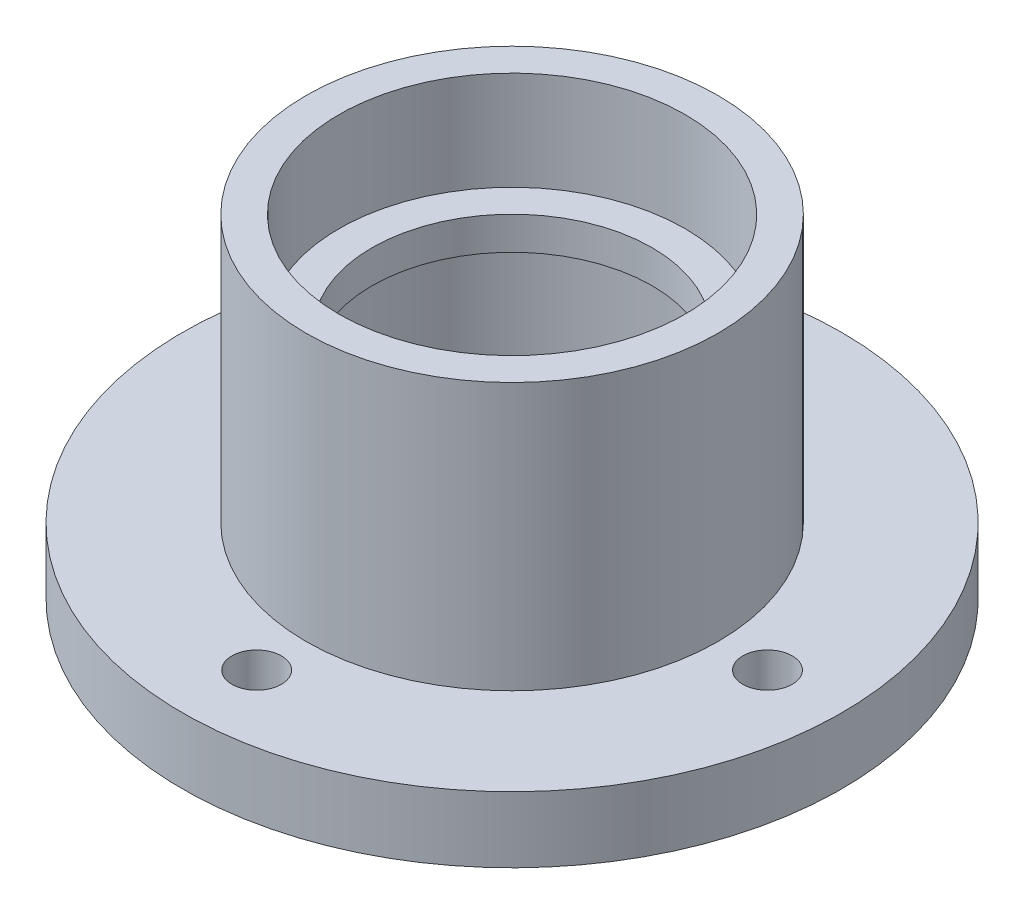
ISO-10303-21;
HEADER;
FILE_DESCRIPTION(('STEP AP214'),'2;1');
FILE_NAME('part.step','',(''),(''),'','','');
FILE_SCHEMA(('AUTOMOTIVE_DESIGN { 1 0 10303 214 1 1 1 1 }'));
ENDSEC;
DATA;
#1=APPLICATION_CONTEXT('core data for automotive mechanical design processes');
#2=APPLICATION_PROTOCOL_DEFINITION('international standard','automotive_design',2000,#1);
#3=PRODUCT_CONTEXT('',#1,'mechanical');
#4=PRODUCT('Part','Part','',(#3));
#5=PRODUCT_RELATED_PRODUCT_CATEGORY('part','',(#4));
#6=PRODUCT_DEFINITION_FORMATION('','',#4);
#7=PRODUCT_DEFINITION_CONTEXT('part definition',#1,'design');
#8=PRODUCT_DEFINITION('design','',#6,#7);
#9=PRODUCT_DEFINITION_SHAPE('','',#8);
#10=(LENGTH_UNIT() NAMED_UNIT(*) SI_UNIT(.MILLI.,.METRE.));
#11=(NAMED_UNIT(*) PLANE_ANGLE_UNIT() SI_UNIT($,.RADIAN.));
#12=(NAMED_UNIT(*) SI_UNIT($,.STERADIAN.) SOLID_ANGLE_UNIT());
#13=UNCERTAINTY_MEASURE_WITH_UNIT(LENGTH_MEASURE(1.E-05),#10,'distance_accuracy_value','');
#14=(GEOMETRIC_REPRESENTATION_CONTEXT(3) GLOBAL_UNCERTAINTY_ASSIGNED_CONTEXT((#13)) GLOBAL_UNIT_ASSIGNED_CONTEXT((#10,
#11,#12)) REPRESENTATION_CONTEXT('',''));
#15=CARTESIAN_POINT('',(0.,0.,0.));
#16=DIRECTION('',(0.,0.,1.));
#17=DIRECTION('',(1.,0.,0.));
#18=AXIS2_PLACEMENT_3D('',#15,#16,#17);
#19=CARTESIAN_POINT('',(-12.5,20.2,0.));
#20=DIRECTION('',(0.,-1.,0.));
#21=DIRECTION('',(0.,0.,-1.));
#22=AXIS2_PLACEMENT_3D('',#19,#20,#21);
#23=PLANE('',#22);
#24=CARTESIAN_POINT('',(0.,20.2,0.));
#25=DIRECTION('',(0.,-1.,0.));
#26=DIRECTION('',(0.,0.,-1.));
#27=AXIS2_PLACEMENT_3D('',#24,#25,#26);
#28=CIRCLE('',#27,12.5);
#29=CARTESIAN_POINT('',(0.,20.2,-12.5));
#30=VERTEX_POINT('',#29);
#31=EDGE_CURVE('E75',#30,#30,#28,.T.);
#32=ORIENTED_EDGE('',*,*,#31,.F.);
#33=EDGE_LOOP('',(#32));
#34=FACE_BOUND('',#33,.T.);
#35=CARTESIAN_POINT('',(0.,20.2,0.));
#36=DIRECTION('',(0.,-1.,0.));
#37=DIRECTION('',(0.,0.,-1.));
#38=AXIS2_PLACEMENT_3D('',#35,#36,#37);
#39=CIRCLE('',#38,10.5);
#40=CARTESIAN_POINT('',(0.,20.2,-10.5));
#41=VERTEX_POINT('',#40);
#42=EDGE_CURVE('E10',#41,#41,#39,.T.);
#43=ORIENTED_EDGE('',*,*,#42,.T.);
#44=EDGE_LOOP('',(#43));
#45=FACE_BOUND('',#44,.T.);
#46=ADVANCED_FACE('F41',(#34,#45),#23,.F.);
#47=CARTESIAN_POINT('',(0.,0.,0.));
#48=DIRECTION('',(0.,-1.,0.));
#49=DIRECTION('',(0.,0.,-1.));
#50=AXIS2_PLACEMENT_3D('',#47,#48,#49);
#51=CYLINDRICAL_SURFACE('',#50,10.5);
#52=ORIENTED_EDGE('',*,*,#42,.F.);
#53=EDGE_LOOP('',(#52));
#54=FACE_BOUND('',#53,.T.);
#55=CARTESIAN_POINT('',(0.,14.2,0.));
#56=DIRECTION('',(0.,-1.,0.));
#57=DIRECTION('',(0.,0.,-1.));
#58=AXIS2_PLACEMENT_3D('',#55,#56,#57);
#59=CIRCLE('',#58,10.5);
#60=CARTESIAN_POINT('',(0.,14.2,-10.5));
#61=VERTEX_POINT('',#60);
#62=EDGE_CURVE('E47',#61,#61,#59,.T.);
#63=ORIENTED_EDGE('',*,*,#62,.T.);
#64=EDGE_LOOP('',(#63));
#65=FACE_BOUND('',#64,.T.);
#66=ADVANCED_FACE('F136',(#54,#65),#51,.F.);
#67=CARTESIAN_POINT('',(-10.5,14.2,0.));
#68=DIRECTION('',(0.,-1.,0.));
#69=DIRECTION('',(0.,0.,-1.));
#70=AXIS2_PLACEMENT_3D('',#67,#68,#69);
#71=PLANE('',#70);
#72=ORIENTED_EDGE('',*,*,#62,.F.);
#73=EDGE_LOOP('',(#72));
#74=FACE_BOUND('',#73,.T.);
#75=CARTESIAN_POINT('',(0.,14.2,0.));
#76=DIRECTION('',(0.,-1.,0.));
#77=DIRECTION('',(0.,0.,-1.));
#78=AXIS2_PLACEMENT_3D('',#75,#76,#77);
#79=CIRCLE('',#78,8.5);
#80=CARTESIAN_POINT('',(0.,14.2,-8.5));
#81=VERTEX_POINT('',#80);
#82=EDGE_CURVE('E51',#81,#81,#79,.T.);
#83=ORIENTED_EDGE('',*,*,#82,.T.);
#84=EDGE_LOOP('',(#83));
#85=FACE_BOUND('',#84,.T.);
#86=ADVANCED_FACE('F140',(#74,#85),#71,.F.);
#87=CARTESIAN_POINT('',(0.,0.,0.));
#88=DIRECTION('',(0.,-1.,0.));
#89=DIRECTION('',(0.,0.,-1.));
#90=AXIS2_PLACEMENT_3D('',#87,#88,#89);
#91=CYLINDRICAL_SURFACE('',#90,8.5);
#92=ORIENTED_EDGE('',*,*,#82,.F.);
#93=EDGE_LOOP('',(#92));
#94=FACE_BOUND('',#93,.T.);
#95=CARTESIAN_POINT('',(0.,12.2,0.));
#96=DIRECTION('',(0.,-1.,0.));
#97=DIRECTION('',(0.,0.,-1.));
#98=AXIS2_PLACEMENT_3D('',#95,#96,#97);
#99=CIRCLE('',#98,8.5);
#100=CARTESIAN_POINT('',(0.,12.2,-8.5));
#101=VERTEX_POINT('',#100);
#102=EDGE_CURVE('E55',#101,#101,#99,.T.);
#103=ORIENTED_EDGE('',*,*,#102,.T.);
#104=EDGE_LOOP('',(#103));
#105=FACE_BOUND('',#104,.T.);
#106=ADVANCED_FACE('F145',(#94,#105),#91,.F.);
#107=CARTESIAN_POINT('',(-8.5,12.2,0.));
#108=DIRECTION('',(0.,1.,0.));
#109=DIRECTION('',(0.,0.,1.));
#110=AXIS2_PLACEMENT_3D('',#107,#108,#109);
#111=PLANE('',#110);
#112=ORIENTED_EDGE('',*,*,#102,.F.);
#113=EDGE_LOOP('',(#112));
#114=FACE_BOUND('',#113,.T.);
#115=CARTESIAN_POINT('',(0.,12.2,0.));
#116=DIRECTION('',(0.,-1.,0.));
#117=DIRECTION('',(0.,0.,-1.));
#118=AXIS2_PLACEMENT_3D('',#115,#116,#117);
#119=CIRCLE('',#118,10.5);
#120=CARTESIAN_POINT('',(0.,12.2,-10.5));
#121=VERTEX_POINT('',#120);
#122=EDGE_CURVE('E60',#121,#121,#119,.T.);
#123=ORIENTED_EDGE('',*,*,#122,.T.);
#124=EDGE_LOOP('',(#123));
#125=FACE_BOUND('',#124,.T.);
#126=ADVANCED_FACE('F151',(#114,#125),#111,.F.);
#127=CARTESIAN_POINT('',(0.,0.,0.));
#128=DIRECTION('',(0.,-1.,0.));
#129=DIRECTION('',(0.,0.,-1.));
#130=AXIS2_PLACEMENT_3D('',#127,#128,#129);
#131=CYLINDRICAL_SURFACE('',#130,10.5);
#132=ORIENTED_EDGE('',*,*,#122,.F.);
#133=EDGE_LOOP('',(#132));
#134=FACE_BOUND('',#133,.T.);
#135=CARTESIAN_POINT('',(0.,0.,0.));
#136=DIRECTION('',(0.,-1.,0.));
#137=DIRECTION('',(0.,0.,-1.));
#138=AXIS2_PLACEMENT_3D('',#135,#136,#137);
#139=CIRCLE('',#138,10.5);
#140=CARTESIAN_POINT('',(0.,0.,-10.5));
#141=VERTEX_POINT('',#140);
#142=EDGE_CURVE('E63',#141,#141,#139,.T.);
#143=ORIENTED_EDGE('',*,*,#142,.T.);
#144=EDGE_LOOP('',(#143));
#145=FACE_BOUND('',#144,.T.);
#146=ADVANCED_FACE('F155',(#134,#145),#131,.F.);
#147=CARTESIAN_POINT('',(-10.5,0.,0.));
#148=DIRECTION('',(0.,1.,0.));
#149=DIRECTION('',(0.,0.,1.));
#150=AXIS2_PLACEMENT_3D('',#147,#148,#149);
#151=PLANE('',#150);
#152=CARTESIAN_POINT('',(0.,0.,-15.5));
#153=DIRECTION('',(0.,1.,0.));
#154=DIRECTION('',(0.,0.,1.));
#155=AXIS2_PLACEMENT_3D('',#152,#153,#154);
#156=CIRCLE('',#155,1.5);
#157=CARTESIAN_POINT('',(0.,0.,-14.));
#158=VERTEX_POINT('',#157);
#159=EDGE_CURVE('E78',#158,#158,#156,.T.);
#160=ORIENTED_EDGE('',*,*,#159,.T.);
#161=EDGE_LOOP('',(#160));
#162=FACE_BOUND('',#161,.T.);
#163=CARTESIAN_POINT('',(15.5,0.,0.));
#164=DIRECTION('',(0.,1.,0.));
#165=DIRECTION('',(0.,0.,1.));
#166=AXIS2_PLACEMENT_3D('',#163,#164,#165);
#167=CIRCLE('',#166,1.5);
#168=CARTESIAN_POINT('',(15.5,0.,1.5));
#169=VERTEX_POINT('',#168);
#170=EDGE_CURVE('E91',#169,#169,#167,.T.);
#171=ORIENTED_EDGE('',*,*,#170,.T.);
#172=EDGE_LOOP('',(#171));
#173=FACE_BOUND('',#172,.T.);
#174=CARTESIAN_POINT('',(0.,0.,15.5));
#175=DIRECTION('',(0.,1.,0.));
#176=DIRECTION('',(0.,0.,1.));
#177=AXIS2_PLACEMENT_3D('',#174,#175,#176);
#178=CIRCLE('',#177,1.5);
#179=CARTESIAN_POINT('',(0.,0.,17.));
#180=VERTEX_POINT('',#179);
#181=EDGE_CURVE('E85',#180,#180,#178,.T.);
#182=ORIENTED_EDGE('',*,*,#181,.T.);
#183=EDGE_LOOP('',(#182));
#184=FACE_BOUND('',#183,.T.);
#185=CARTESIAN_POINT('',(-15.5,0.,0.));
#186=DIRECTION('',(0.,1.,0.));
#187=DIRECTION('',(0.,0.,1.));
#188=AXIS2_PLACEMENT_3D('',#185,#186,#187);
#189=CIRCLE('',#188,1.5);
#190=CARTESIAN_POINT('',(-15.5,0.,1.5));
#191=VERTEX_POINT('',#190);
#192=EDGE_CURVE('E79',#191,#191,#189,.T.);
#193=ORIENTED_EDGE('',*,*,#192,.T.);
#194=EDGE_LOOP('',(#193));
#195=FACE_BOUND('',#194,.T.);
#196=ORIENTED_EDGE('',*,*,#142,.F.);
#197=EDGE_LOOP('',(#196));
#198=FACE_BOUND('',#197,.T.);
#199=CARTESIAN_POINT('',(0.,0.,0.));
#200=DIRECTION('',(0.,-1.,0.));
#201=DIRECTION('',(0.,0.,-1.));
#202=AXIS2_PLACEMENT_3D('',#199,#200,#201);
#203=CIRCLE('',#202,20.);
#204=CARTESIAN_POINT('',(0.,0.,-20.));
#205=VERTEX_POINT('',#204);
#206=EDGE_CURVE('E66',#205,#205,#203,.T.);
#207=ORIENTED_EDGE('',*,*,#206,.T.);
#208=EDGE_LOOP('',(#207));
#209=FACE_BOUND('',#208,.T.);
#210=ADVANCED_FACE('F103',(#162,#173,#184,#195,#198,#209),#151,.F.);
#211=CARTESIAN_POINT('',(0.,0.,0.));
#212=DIRECTION('',(0.,-1.,0.));
#213=DIRECTION('',(0.,0.,-1.));
#214=AXIS2_PLACEMENT_3D('',#211,#212,#213);
#215=CYLINDRICAL_SURFACE('',#214,20.);
#216=ORIENTED_EDGE('',*,*,#206,.F.);
#217=EDGE_LOOP('',(#216));
#218=FACE_BOUND('',#217,.T.);
#219=CARTESIAN_POINT('',(0.,4.,0.));
#220=DIRECTION('',(0.,-1.,0.));
#221=DIRECTION('',(0.,0.,-1.));
#222=AXIS2_PLACEMENT_3D('',#219,#220,#221);
#223=CIRCLE('',#222,20.);
#224=CARTESIAN_POINT('',(0.,4.,-20.));
#225=VERTEX_POINT('',#224);
#226=EDGE_CURVE('E69',#225,#225,#223,.T.);
#227=ORIENTED_EDGE('',*,*,#226,.T.);
#228=EDGE_LOOP('',(#227));
#229=FACE_BOUND('',#228,.T.);
#230=ADVANCED_FACE('F117',(#218,#229),#215,.T.);
#231=CARTESIAN_POINT('',(-20.,4.,0.));
#232=DIRECTION('',(0.,-1.,0.));
#233=DIRECTION('',(0.,0.,-1.));
#234=AXIS2_PLACEMENT_3D('',#231,#232,#233);
#235=PLANE('',#234);
#236=CARTESIAN_POINT('',(0.,4.,-15.5));
#237=DIRECTION('',(0.,1.,0.));
#238=DIRECTION('',(0.,0.,1.));
#239=AXIS2_PLACEMENT_3D('',#236,#237,#238);
#240=CIRCLE('',#239,1.5);
#241=CARTESIAN_POINT('',(0.,4.,-14.));
#242=VERTEX_POINT('',#241);
#243=EDGE_CURVE('E97',#242,#242,#240,.T.);
#244=ORIENTED_EDGE('',*,*,#243,.F.);
#245=EDGE_LOOP('',(#244));
#246=FACE_BOUND('',#245,.T.);
#247=CARTESIAN_POINT('',(15.5,4.,0.));
#248=DIRECTION('',(0.,1.,0.));
#249=DIRECTION('',(0.,0.,1.));
#250=AXIS2_PLACEMENT_3D('',#247,#248,#249);
#251=CIRCLE('',#250,1.5);
#252=CARTESIAN_POINT('',(15.5,4.,1.5));
#253=VERTEX_POINT('',#252);
#254=EDGE_CURVE('E94',#253,#253,#251,.T.);
#255=ORIENTED_EDGE('',*,*,#254,.F.);
#256=EDGE_LOOP('',(#255));
#257=FACE_BOUND('',#256,.T.);
#258=CARTESIAN_POINT('',(0.,4.,15.5));
#259=DIRECTION('',(0.,1.,0.));
#260=DIRECTION('',(0.,0.,1.));
#261=AXIS2_PLACEMENT_3D('',#258,#259,#260);
#262=CIRCLE('',#261,1.5);
#263=CARTESIAN_POINT('',(0.,4.,17.));
#264=VERTEX_POINT('',#263);
#265=EDGE_CURVE('E88',#264,#264,#262,.T.);
#266=ORIENTED_EDGE('',*,*,#265,.F.);
#267=EDGE_LOOP('',(#266));
#268=FACE_BOUND('',#267,.T.);
#269=CARTESIAN_POINT('',(-15.5,4.,0.));
#270=DIRECTION('',(0.,1.,0.));
#271=DIRECTION('',(0.,0.,1.));
#272=AXIS2_PLACEMENT_3D('',#269,#270,#271);
#273=CIRCLE('',#272,1.5);
#274=CARTESIAN_POINT('',(-15.5,4.,1.5));
#275=VERTEX_POINT('',#274);
#276=EDGE_CURVE('E82',#275,#275,#273,.T.);
#277=ORIENTED_EDGE('',*,*,#276,.F.);
#278=EDGE_LOOP('',(#277));
#279=FACE_BOUND('',#278,.T.);
#280=ORIENTED_EDGE('',*,*,#226,.F.);
#281=EDGE_LOOP('',(#280));
#282=FACE_BOUND('',#281,.T.);
#283=CARTESIAN_POINT('',(0.,4.,0.));
#284=DIRECTION('',(0.,-1.,0.));
#285=DIRECTION('',(0.,0.,-1.));
#286=AXIS2_PLACEMENT_3D('',#283,#284,#285);
#287=CIRCLE('',#286,12.5);
#288=CARTESIAN_POINT('',(0.,4.,-12.5));
#289=VERTEX_POINT('',#288);
#290=EDGE_CURVE('E72',#289,#289,#287,.T.);
#291=ORIENTED_EDGE('',*,*,#290,.T.);
#292=EDGE_LOOP('',(#291));
#293=FACE_BOUND('',#292,.T.);
#294=ADVANCED_FACE('F113',(#246,#257,#268,#279,#282,#293),#235,.F.);
#295=CARTESIAN_POINT('',(0.,0.,0.));
#296=DIRECTION('',(0.,-1.,0.));
#297=DIRECTION('',(0.,0.,-1.));
#298=AXIS2_PLACEMENT_3D('',#295,#296,#297);
#299=CYLINDRICAL_SURFACE('',#298,12.5);
#300=ORIENTED_EDGE('',*,*,#290,.F.);
#301=EDGE_LOOP('',(#300));
#302=FACE_BOUND('',#301,.T.);
#303=ORIENTED_EDGE('',*,*,#31,.T.);
#304=EDGE_LOOP('',(#303));
#305=FACE_BOUND('',#304,.T.);
#306=ADVANCED_FACE('F116',(#302,#305),#299,.T.);
#307=CARTESIAN_POINT('',(-15.5,0.,0.));
#308=DIRECTION('',(0.,1.,0.));
#309=DIRECTION('',(0.,0.,1.));
#310=AXIS2_PLACEMENT_3D('',#307,#308,#309);
#311=CYLINDRICAL_SURFACE('',#310,1.5);
#312=ORIENTED_EDGE('',*,*,#192,.F.);
#313=EDGE_LOOP('',(#312));
#314=FACE_BOUND('',#313,.T.);
#315=ORIENTED_EDGE('',*,*,#276,.T.);
#316=EDGE_LOOP('',(#315));
#317=FACE_BOUND('',#316,.T.);
#318=ADVANCED_FACE('F131',(#314,#317),#311,.F.);
#319=CARTESIAN_POINT('',(0.,0.,15.5));
#320=DIRECTION('',(0.,1.,0.));
#321=DIRECTION('',(0.,0.,1.));
#322=AXIS2_PLACEMENT_3D('',#319,#320,#321);
#323=CYLINDRICAL_SURFACE('',#322,1.5);
#324=ORIENTED_EDGE('',*,*,#181,.F.);
#325=EDGE_LOOP('',(#324));
#326=FACE_BOUND('',#325,.T.);
#327=ORIENTED_EDGE('',*,*,#265,.T.);
#328=EDGE_LOOP('',(#327));
#329=FACE_BOUND('',#328,.T.);
#330=ADVANCED_FACE('F167',(#326,#329),#323,.F.);
#331=CARTESIAN_POINT('',(15.5,0.,0.));
#332=DIRECTION('',(0.,1.,0.));
#333=DIRECTION('',(0.,0.,1.));
#334=AXIS2_PLACEMENT_3D('',#331,#332,#333);
#335=CYLINDRICAL_SURFACE('',#334,1.5);
#336=ORIENTED_EDGE('',*,*,#170,.F.);
#337=EDGE_LOOP('',(#336));
#338=FACE_BOUND('',#337,.T.);
#339=ORIENTED_EDGE('',*,*,#254,.T.);
#340=EDGE_LOOP('',(#339));
#341=FACE_BOUND('',#340,.T.);
#342=ADVANCED_FACE('F109',(#338,#341),#335,.F.);
#343=CARTESIAN_POINT('',(0.,0.,-15.5));
#344=DIRECTION('',(0.,1.,0.));
#345=DIRECTION('',(0.,0.,1.));
#346=AXIS2_PLACEMENT_3D('',#343,#344,#345);
#347=CYLINDRICAL_SURFACE('',#346,1.5);
#348=ORIENTED_EDGE('',*,*,#159,.F.);
#349=EDGE_LOOP('',(#348));
#350=FACE_BOUND('',#349,.T.);
#351=ORIENTED_EDGE('',*,*,#243,.T.);
#352=EDGE_LOOP('',(#351));
#353=FACE_BOUND('',#352,.T.);
#354=ADVANCED_FACE('F106',(#350,#353),#347,.F.);
#355=CLOSED_SHELL('',(#46,#66,#86,#106,#126,#146,#210,#230,#294,#306,#318,#330,#342,#354));
#356=MANIFOLD_SOLID_BREP('B2',#355);
#357=ADVANCED_BREP_SHAPE_REPRESENTATION('',(#18,#356),#14);
#358=SHAPE_DEFINITION_REPRESENTATION(#9,#357);
ENDSEC;
END-ISO-10303-21;
